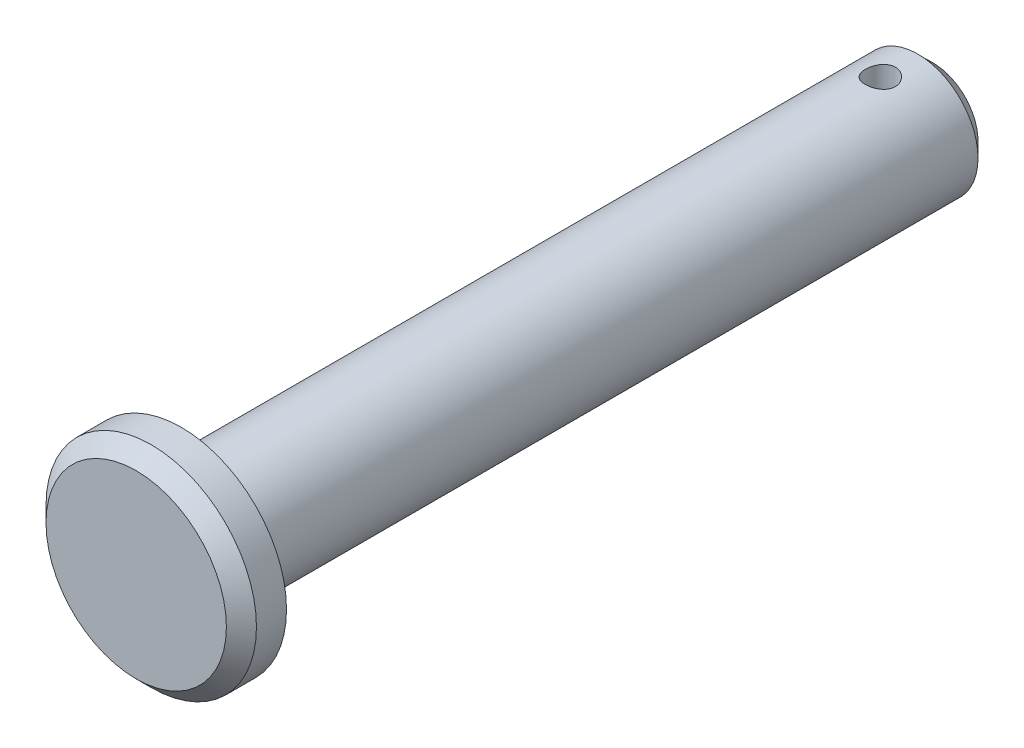
ISO-10303-21;
HEADER;
FILE_DESCRIPTION(('STEP AP214'),'2;1');
FILE_NAME('part.step','',(''),(''),'','','');
FILE_SCHEMA(('AUTOMOTIVE_DESIGN { 1 0 10303 214 1 1 1 1 }'));
ENDSEC;
DATA;
#1=APPLICATION_CONTEXT('core data for automotive mechanical design processes');
#2=APPLICATION_PROTOCOL_DEFINITION('international standard','automotive_design',2000,#1);
#3=PRODUCT_CONTEXT('',#1,'mechanical');
#4=PRODUCT('Part','Part','',(#3));
#5=PRODUCT_RELATED_PRODUCT_CATEGORY('part','',(#4));
#6=PRODUCT_DEFINITION_FORMATION('','',#4);
#7=PRODUCT_DEFINITION_CONTEXT('part definition',#1,'design');
#8=PRODUCT_DEFINITION('design','',#6,#7);
#9=PRODUCT_DEFINITION_SHAPE('','',#8);
#10=(LENGTH_UNIT() NAMED_UNIT(*) SI_UNIT(.MILLI.,.METRE.));
#11=(NAMED_UNIT(*) PLANE_ANGLE_UNIT() SI_UNIT($,.RADIAN.));
#12=(NAMED_UNIT(*) SI_UNIT($,.STERADIAN.) SOLID_ANGLE_UNIT());
#13=UNCERTAINTY_MEASURE_WITH_UNIT(LENGTH_MEASURE(1.E-05),#10,'distance_accuracy_value','');
#14=(GEOMETRIC_REPRESENTATION_CONTEXT(3) GLOBAL_UNCERTAINTY_ASSIGNED_CONTEXT((#13)) GLOBAL_UNIT_ASSIGNED_CONTEXT((#10,
#11,#12)) REPRESENTATION_CONTEXT('',''));
#15=CARTESIAN_POINT('',(0.,0.,0.));
#16=DIRECTION('',(0.,0.,1.));
#17=DIRECTION('',(1.,0.,0.));
#18=AXIS2_PLACEMENT_3D('',#15,#16,#17);
#19=CARTESIAN_POINT('',(0.,-20.1940334543548,3.5));
#20=DIRECTION('',(0.,1.,0.));
#21=DIRECTION('',(0.,0.,1.));
#22=AXIS2_PLACEMENT_3D('',#19,#20,#21);
#23=CYLINDRICAL_SURFACE('',#22,1.);
#24=CARTESIAN_POINT('',(0.,-4.,4.5));
#25=CARTESIAN_POINT('',(-0.0552507257798206,-3.99999906578675,4.49999844950789));
#26=CARTESIAN_POINT('',(-0.110518771887175,-3.99884385421219,4.49540563281747));
#27=CARTESIAN_POINT('',(-0.219470882513688,-3.99434742553262,4.477183232462));
#28=CARTESIAN_POINT('',(-0.27315403124716,-3.99100496946647,4.46354852697477));
#29=CARTESIAN_POINT('',(-0.377347248121717,-3.98250417554694,4.42770716435861));
#30=CARTESIAN_POINT('',(-0.427861042286667,-3.97734801894725,4.40551080085648));
#31=CARTESIAN_POINT('',(-0.524448087936283,-3.96576895871729,4.35321240663678));
#32=CARTESIAN_POINT('',(-0.570521189565839,-3.95934601236034,4.32311010925404));
#33=CARTESIAN_POINT('',(-0.657867951533947,-3.94578275727868,4.25519947356386));
#34=CARTESIAN_POINT('',(-0.699037126707381,-3.93863138099022,4.21725895002722));
#35=CARTESIAN_POINT('',(-0.774499284802202,-3.92449080078353,4.13503186339406));
#36=CARTESIAN_POINT('',(-0.808791491299423,-3.91750161525566,4.09074458470233));
#37=CARTESIAN_POINT('',(-0.870017695199355,-3.90436517133141,3.99626984884171));
#38=CARTESIAN_POINT('',(-0.896834810616904,-3.89823196313737,3.94600451279306));
#39=CARTESIAN_POINT('',(-0.941597939033685,-3.88766329874815,3.84150105889443));
#40=CARTESIAN_POINT('',(-0.959545370292889,-3.88322757115193,3.78726357778283));
#41=CARTESIAN_POINT('',(-0.985703224536194,-3.87666984478368,3.67750433453168));
#42=CARTESIAN_POINT('',(-0.994101512222225,-3.87450327383617,3.62203006930014));
#43=CARTESIAN_POINT('',(-1.00150785004523,-3.87259575025161,3.51042095399068));
#44=CARTESIAN_POINT('',(-1.00051742787865,-3.87285440299097,3.4542862128676));
#45=CARTESIAN_POINT('',(-0.989324349759521,-3.87572803664413,3.34438946150368));
#46=CARTESIAN_POINT('',(-0.979345560127013,-3.87828575334586,3.29060291902327));
#47=CARTESIAN_POINT('',(-0.950816124602071,-3.88537806450989,3.1854926327258));
#48=CARTESIAN_POINT('',(-0.932264868046283,-3.88991279980465,3.13416906464734));
#49=CARTESIAN_POINT('',(-0.886926318624769,-3.90050075936126,3.03484132249862));
#50=CARTESIAN_POINT('',(-0.860057778155272,-3.90656884979614,2.98687588547363));
#51=CARTESIAN_POINT('',(-0.798904184009968,-3.91953140564257,2.89605419349544));
#52=CARTESIAN_POINT('',(-0.764617832539226,-3.92642601556491,2.85319883462183));
#53=CARTESIAN_POINT('',(-0.688442283120812,-3.94050587026522,2.7725309228704));
#54=CARTESIAN_POINT('',(-0.646364172110573,-3.94769379651981,2.73489700662577));
#55=CARTESIAN_POINT('',(-0.556407945002465,-3.96137310385857,2.6671858383574));
#56=CARTESIAN_POINT('',(-0.508529651805295,-3.96786446366278,2.63710881715762));
#57=CARTESIAN_POINT('',(-0.408077259120927,-3.97945154729456,2.58529960918374));
#58=CARTESIAN_POINT('',(-0.355487595472414,-3.9845424008515,2.56359643983038));
#59=CARTESIAN_POINT('',(-0.247250672095254,-3.99271944660946,2.52938846286028));
#60=CARTESIAN_POINT('',(-0.191603999433656,-3.99580602226188,2.51688189572124));
#61=CARTESIAN_POINT('',(-0.080359980260018,-3.9995699951425,2.50169495629411));
#62=CARTESIAN_POINT('',(-0.0247978133254733,-4.00030702338852,2.4987713159498));
#63=CARTESIAN_POINT('',(0.0860219165343387,-3.99945869876301,2.50216600137033));
#64=CARTESIAN_POINT('',(0.14127950642973,-3.99787355494565,2.50848349519942));
#65=CARTESIAN_POINT('',(0.249076179184328,-3.99259720751572,2.52998060559425));
#66=CARTESIAN_POINT('',(0.301643412645835,-3.98893756123874,2.54502750898466));
#67=CARTESIAN_POINT('',(0.403504861635007,-3.97992471089423,2.58340472268563));
#68=CARTESIAN_POINT('',(0.452798746021757,-3.97457133579929,2.60673586954211));
#69=CARTESIAN_POINT('',(0.547682089619898,-3.96262205284208,2.66149075258315));
#70=CARTESIAN_POINT('',(0.593190294557219,-3.95600578244621,2.69305074159784));
#71=CARTESIAN_POINT('',(0.678351075762163,-3.94229672791613,2.76319327253131));
#72=CARTESIAN_POINT('',(0.718002639315339,-3.93520386167804,2.80177702641127));
#73=CARTESIAN_POINT('',(0.791327045381821,-3.92112637973848,2.88600130722964));
#74=CARTESIAN_POINT('',(0.824829245081355,-3.91414869458187,2.93179180200161));
#75=CARTESIAN_POINT('',(0.883673839341798,-3.90128585584826,3.02848842297714));
#76=CARTESIAN_POINT('',(0.909016596105291,-3.89540065378019,3.07939432197317));
#77=CARTESIAN_POINT('',(0.950634280406194,-3.88545396489778,3.18460381494206));
#78=CARTESIAN_POINT('',(0.96696293110271,-3.88138170194604,3.23888508556267));
#79=CARTESIAN_POINT('',(0.990230439969186,-3.87551162726789,3.34953975859274));
#80=CARTESIAN_POINT('',(0.997171351652439,-3.87371331813292,3.40591270068833));
#81=CARTESIAN_POINT('',(1.00135906022266,-3.87263267469306,3.51741401590347));
#82=CARTESIAN_POINT('',(0.998878598520078,-3.87327955152176,3.57253162341649));
#83=CARTESIAN_POINT('',(0.984918185541911,-3.87685272671895,3.68153592577866));
#84=CARTESIAN_POINT('',(0.973438415124512,-3.87977897927905,3.73542264534243));
#85=CARTESIAN_POINT('',(0.941954212961862,-3.88754173788483,3.84013897271027));
#86=CARTESIAN_POINT('',(0.922000936453582,-3.89236676824206,3.89098487016014));
#87=CARTESIAN_POINT('',(0.874176609070046,-3.90338503816552,3.9886435884758));
#88=CARTESIAN_POINT('',(0.846304460022792,-3.90957846747183,4.03545584879128));
#89=CARTESIAN_POINT('',(0.782578499091423,-3.92283756175676,4.12503641933468));
#90=CARTESIAN_POINT('',(0.746535441941501,-3.92992176554505,4.16766738228264));
#91=CARTESIAN_POINT('',(0.667859580793155,-3.94405351497524,4.24636469653027));
#92=CARTESIAN_POINT('',(0.625225214174096,-3.95110105151374,4.28242948674198));
#93=CARTESIAN_POINT('',(0.533645057801726,-3.96451770431776,4.34760753904307));
#94=CARTESIAN_POINT('',(0.484598948210923,-3.97087222243912,4.37658307578105));
#95=CARTESIAN_POINT('',(0.382177373006983,-3.98203283316746,4.42583164196035));
#96=CARTESIAN_POINT('',(0.328805042291159,-3.98684003466522,4.44611090709902));
#97=CARTESIAN_POINT('',(0.229606835495648,-3.99365373043695,4.47438122021977));
#98=CARTESIAN_POINT('',(0.184253447272046,-3.99601723368461,4.48396749536896));
#99=CARTESIAN_POINT('',(0.0926040476908554,-3.99919070154632,4.49677729574796));
#100=CARTESIAN_POINT('',(0.0463081074950775,-4.00000078300596,4.50000129953687));
#101=CARTESIAN_POINT('',(0.,-4.,4.5));
#102=B_SPLINE_CURVE_WITH_KNOTS('',3,(#24,#25,#26,#27,#28,#29,#30,#31,#32,#33,#34,#35,#36,#37,
#38,#39,#40,#41,#42,#43,#44,#45,#46,#47,#48,#49,#50,#51,#52,#53,#54,#55,#56,#57,#58,#59,#60,#61,
#62,#63,#64,#65,#66,#67,#68,#69,#70,#71,#72,#73,#74,#75,#76,#77,#78,#79,#80,#81,#82,#83,#84,#85,
#86,#87,#88,#89,#90,#91,#92,#93,#94,#95,#96,#97,#98,#99,#100,#101),.UNSPECIFIED.,.T.,.F.,(4,2,2,
2,2,2,2,2,2,2,2,2,2,2,2,2,2,2,2,2,2,2,2,2,2,2,2,2,2,2,2,2,2,2,2,2,2,2,4),(0.,0.165582474981259,
0.331258825175932,0.496736601524069,0.662219960112883,0.83076290291426,0.99932486386708,
1.17039098363871,1.34142974112912,1.50904196732953,1.67662692075131,1.84014998004679,
2.00368468977359,2.16887018582586,2.33408460557442,2.50401000646013,2.67394059705498,
2.84445486006076,3.01493649125762,3.18105539299517,3.34715934075162,3.51080183009358,
3.67446084881527,3.84102391710235,4.00761575338679,4.17829672802984,4.34897012499672,
4.51861503076025,4.68822282168272,4.85295853599075,5.0176909397069,5.18144267039632,
5.34521712091268,5.51326384273274,5.68135046513612,5.85248123666392,6.02348909214233,
6.16228161961433,6.3010637069536),.UNSPECIFIED.);
#103=CARTESIAN_POINT('',(0.,-4.,4.5));
#104=VERTEX_POINT('',#103);
#105=EDGE_CURVE('E19',#104,#104,#102,.F.);
#106=ORIENTED_EDGE('',*,*,#105,.F.);
#107=EDGE_LOOP('',(#106));
#108=FACE_BOUND('',#107,.T.);
#109=CARTESIAN_POINT('',(0.,4.,4.5));
#110=CARTESIAN_POINT('',(0.0552507257798206,3.99999906578675,4.49999844950789));
#111=CARTESIAN_POINT('',(0.110518771887175,3.99884385421219,4.49540563281747));
#112=CARTESIAN_POINT('',(0.219470882513688,3.99434742553262,4.477183232462));
#113=CARTESIAN_POINT('',(0.27315403124716,3.99100496946647,4.46354852697477));
#114=CARTESIAN_POINT('',(0.377347248121717,3.98250417554694,4.42770716435861));
#115=CARTESIAN_POINT('',(0.427861042286667,3.97734801894725,4.40551080085648));
#116=CARTESIAN_POINT('',(0.524448087936283,3.96576895871729,4.35321240663678));
#117=CARTESIAN_POINT('',(0.570521189565839,3.95934601236034,4.32311010925404));
#118=CARTESIAN_POINT('',(0.657867951533947,3.94578275727868,4.25519947356386));
#119=CARTESIAN_POINT('',(0.699037126707381,3.93863138099022,4.21725895002722));
#120=CARTESIAN_POINT('',(0.774499284802202,3.92449080078353,4.13503186339406));
#121=CARTESIAN_POINT('',(0.808791491299423,3.91750161525566,4.09074458470233));
#122=CARTESIAN_POINT('',(0.870017695199355,3.90436517133141,3.99626984884171));
#123=CARTESIAN_POINT('',(0.896834810616904,3.89823196313737,3.94600451279306));
#124=CARTESIAN_POINT('',(0.941597939033685,3.88766329874815,3.84150105889443));
#125=CARTESIAN_POINT('',(0.959545370292889,3.88322757115193,3.78726357778283));
#126=CARTESIAN_POINT('',(0.985703224536194,3.87666984478368,3.67750433453168));
#127=CARTESIAN_POINT('',(0.994101512222225,3.87450327383617,3.62203006930014));
#128=CARTESIAN_POINT('',(1.00150785004523,3.87259575025161,3.51042095399068));
#129=CARTESIAN_POINT('',(1.00051742787865,3.87285440299097,3.4542862128676));
#130=CARTESIAN_POINT('',(0.989324349759521,3.87572803664413,3.34438946150368));
#131=CARTESIAN_POINT('',(0.979345560127013,3.87828575334586,3.29060291902327));
#132=CARTESIAN_POINT('',(0.950816124602071,3.88537806450989,3.1854926327258));
#133=CARTESIAN_POINT('',(0.932264868046283,3.88991279980465,3.13416906464734));
#134=CARTESIAN_POINT('',(0.886926318624769,3.90050075936126,3.03484132249862));
#135=CARTESIAN_POINT('',(0.860057778155272,3.90656884979614,2.98687588547363));
#136=CARTESIAN_POINT('',(0.798904184009968,3.91953140564257,2.89605419349544));
#137=CARTESIAN_POINT('',(0.764617832539226,3.92642601556491,2.85319883462183));
#138=CARTESIAN_POINT('',(0.688442283120812,3.94050587026522,2.7725309228704));
#139=CARTESIAN_POINT('',(0.646364172110573,3.94769379651981,2.73489700662577));
#140=CARTESIAN_POINT('',(0.556407945002465,3.96137310385857,2.6671858383574));
#141=CARTESIAN_POINT('',(0.508529651805295,3.96786446366278,2.63710881715762));
#142=CARTESIAN_POINT('',(0.408077259120927,3.97945154729456,2.58529960918374));
#143=CARTESIAN_POINT('',(0.355487595472414,3.9845424008515,2.56359643983038));
#144=CARTESIAN_POINT('',(0.247250672095254,3.99271944660946,2.52938846286028));
#145=CARTESIAN_POINT('',(0.191603999433656,3.99580602226188,2.51688189572124));
#146=CARTESIAN_POINT('',(0.080359980260018,3.9995699951425,2.50169495629411));
#147=CARTESIAN_POINT('',(0.0247978133254733,4.00030702338852,2.4987713159498));
#148=CARTESIAN_POINT('',(-0.0860219165343387,3.99945869876301,2.50216600137033));
#149=CARTESIAN_POINT('',(-0.14127950642973,3.99787355494565,2.50848349519942));
#150=CARTESIAN_POINT('',(-0.249076179184328,3.99259720751572,2.52998060559425));
#151=CARTESIAN_POINT('',(-0.301643412645835,3.98893756123874,2.54502750898466));
#152=CARTESIAN_POINT('',(-0.403504861635007,3.97992471089423,2.58340472268563));
#153=CARTESIAN_POINT('',(-0.452798746021757,3.97457133579929,2.60673586954211));
#154=CARTESIAN_POINT('',(-0.547682089619898,3.96262205284208,2.66149075258315));
#155=CARTESIAN_POINT('',(-0.593190294557219,3.95600578244621,2.69305074159784));
#156=CARTESIAN_POINT('',(-0.678351075762163,3.94229672791613,2.76319327253131));
#157=CARTESIAN_POINT('',(-0.718002639315339,3.93520386167804,2.80177702641127));
#158=CARTESIAN_POINT('',(-0.791327045381821,3.92112637973848,2.88600130722964));
#159=CARTESIAN_POINT('',(-0.824829245081355,3.91414869458187,2.93179180200161));
#160=CARTESIAN_POINT('',(-0.883673839341798,3.90128585584826,3.02848842297714));
#161=CARTESIAN_POINT('',(-0.909016596105291,3.89540065378019,3.07939432197317));
#162=CARTESIAN_POINT('',(-0.950634280406194,3.88545396489778,3.18460381494206));
#163=CARTESIAN_POINT('',(-0.96696293110271,3.88138170194604,3.23888508556267));
#164=CARTESIAN_POINT('',(-0.990230439969186,3.87551162726789,3.34953975859274));
#165=CARTESIAN_POINT('',(-0.997171351652439,3.87371331813292,3.40591270068833));
#166=CARTESIAN_POINT('',(-1.00135906022266,3.87263267469306,3.51741401590347));
#167=CARTESIAN_POINT('',(-0.998878598520078,3.87327955152176,3.57253162341649));
#168=CARTESIAN_POINT('',(-0.984918185541911,3.87685272671895,3.68153592577866));
#169=CARTESIAN_POINT('',(-0.973438415124512,3.87977897927905,3.73542264534243));
#170=CARTESIAN_POINT('',(-0.941954212961862,3.88754173788483,3.84013897271027));
#171=CARTESIAN_POINT('',(-0.922000936453582,3.89236676824206,3.89098487016014));
#172=CARTESIAN_POINT('',(-0.874176609070046,3.90338503816552,3.9886435884758));
#173=CARTESIAN_POINT('',(-0.846304460022792,3.90957846747183,4.03545584879128));
#174=CARTESIAN_POINT('',(-0.782578499091423,3.92283756175676,4.12503641933468));
#175=CARTESIAN_POINT('',(-0.746535441941501,3.92992176554505,4.16766738228264));
#176=CARTESIAN_POINT('',(-0.667859580793155,3.94405351497524,4.24636469653027));
#177=CARTESIAN_POINT('',(-0.625225214174096,3.95110105151374,4.28242948674198));
#178=CARTESIAN_POINT('',(-0.533645057801726,3.96451770431776,4.34760753904307));
#179=CARTESIAN_POINT('',(-0.484598948210923,3.97087222243912,4.37658307578105));
#180=CARTESIAN_POINT('',(-0.382177373006983,3.98203283316746,4.42583164196035));
#181=CARTESIAN_POINT('',(-0.328805042291159,3.98684003466522,4.44611090709902));
#182=CARTESIAN_POINT('',(-0.229606835495648,3.99365373043695,4.47438122021977));
#183=CARTESIAN_POINT('',(-0.184253447272046,3.99601723368461,4.48396749536896));
#184=CARTESIAN_POINT('',(-0.0926040476908554,3.99919070154632,4.49677729574796));
#185=CARTESIAN_POINT('',(-0.0463081074950775,4.00000078300596,4.50000129953687));
#186=CARTESIAN_POINT('',(0.,4.,4.5));
#187=B_SPLINE_CURVE_WITH_KNOTS('',3,(#109,#110,#111,#112,#113,#114,#115,#116,#117,#118,#119,
#120,#121,#122,#123,#124,#125,#126,#127,#128,#129,#130,#131,#132,#133,#134,#135,#136,#137,#138,
#139,#140,#141,#142,#143,#144,#145,#146,#147,#148,#149,#150,#151,#152,#153,#154,#155,#156,#157,
#158,#159,#160,#161,#162,#163,#164,#165,#166,#167,#168,#169,#170,#171,#172,#173,#174,#175,#176,
#177,#178,#179,#180,#181,#182,#183,#184,#185,#186),.UNSPECIFIED.,.T.,.F.,(4,2,2,2,2,2,2,2,2,2,2,
2,2,2,2,2,2,2,2,2,2,2,2,2,2,2,2,2,2,2,2,2,2,2,2,2,2,2,4),(0.,0.165582474981259,
0.331258825175932,0.496736601524069,0.662219960112883,0.83076290291426,0.99932486386708,
1.17039098363871,1.34142974112912,1.50904196732953,1.67662692075131,1.84014998004679,
2.00368468977359,2.16887018582586,2.33408460557442,2.50401000646013,2.67394059705498,
2.84445486006076,3.01493649125762,3.18105539299517,3.34715934075162,3.51080183009358,
3.67446084881527,3.84102391710235,4.00761575338679,4.17829672802984,4.34897012499672,
4.51861503076025,4.68822282168272,4.85295853599075,5.0176909397069,5.18144267039632,
5.34521712091268,5.51326384273274,5.68135046513612,5.85248123666392,6.02348909214233,
6.16228161961433,6.3010637069536),.UNSPECIFIED.);
#188=CARTESIAN_POINT('',(0.,4.,4.5));
#189=VERTEX_POINT('',#188);
#190=EDGE_CURVE('E41',#189,#189,#187,.F.);
#191=ORIENTED_EDGE('',*,*,#190,.F.);
#192=EDGE_LOOP('',(#191));
#193=FACE_BOUND('',#192,.T.);
#194=ADVANCED_FACE('F15',(#108,#193),#23,.F.);
#195=CARTESIAN_POINT('',(0.,0.,53.));
#196=DIRECTION('',(0.,0.,-1.));
#197=DIRECTION('',(-1.,0.,0.));
#198=AXIS2_PLACEMENT_3D('',#195,#196,#197);
#199=CONICAL_SURFACE('',#198,6.,0.785398163397448);
#200=CARTESIAN_POINT('',(0.,0.,53.));
#201=DIRECTION('',(0.,0.,1.));
#202=DIRECTION('',(-1.,0.,0.));
#203=AXIS2_PLACEMENT_3D('',#200,#201,#202);
#204=CIRCLE('',#203,6.);
#205=CARTESIAN_POINT('',(-6.,0.,53.));
#206=VERTEX_POINT('',#205);
#207=EDGE_CURVE('E10',#206,#206,#204,.T.);
#208=ORIENTED_EDGE('',*,*,#207,.F.);
#209=EDGE_LOOP('',(#208));
#210=FACE_BOUND('',#209,.T.);
#211=CARTESIAN_POINT('',(0.,0.,52.));
#212=DIRECTION('',(0.,0.,-1.));
#213=DIRECTION('',(-1.,0.,0.));
#214=AXIS2_PLACEMENT_3D('',#211,#212,#213);
#215=CIRCLE('',#214,7.);
#216=CARTESIAN_POINT('',(-7.,0.,52.));
#217=VERTEX_POINT('',#216);
#218=EDGE_CURVE('E28',#217,#217,#215,.T.);
#219=ORIENTED_EDGE('',*,*,#218,.F.);
#220=EDGE_LOOP('',(#219));
#221=FACE_BOUND('',#220,.T.);
#222=ADVANCED_FACE('F69',(#210,#221),#199,.T.);
#223=CARTESIAN_POINT('',(0.,0.,1.));
#224=DIRECTION('',(0.,0.,1.));
#225=DIRECTION('',(1.,0.,0.));
#226=AXIS2_PLACEMENT_3D('',#223,#224,#225);
#227=CONICAL_SURFACE('',#226,4.,0.785398163397448);
#228=CARTESIAN_POINT('',(0.,0.,1.));
#229=DIRECTION('',(0.,0.,1.));
#230=DIRECTION('',(1.,0.,0.));
#231=AXIS2_PLACEMENT_3D('',#228,#229,#230);
#232=CIRCLE('',#231,4.);
#233=CARTESIAN_POINT('',(4.,0.,1.));
#234=VERTEX_POINT('',#233);
#235=EDGE_CURVE('E47',#234,#234,#232,.T.);
#236=ORIENTED_EDGE('',*,*,#235,.F.);
#237=EDGE_LOOP('',(#236));
#238=FACE_BOUND('',#237,.T.);
#239=CARTESIAN_POINT('',(0.,0.,0.));
#240=DIRECTION('',(0.,0.,-1.));
#241=DIRECTION('',(1.,0.,0.));
#242=AXIS2_PLACEMENT_3D('',#239,#240,#241);
#243=CIRCLE('',#242,3.);
#244=CARTESIAN_POINT('',(3.,0.,0.));
#245=VERTEX_POINT('',#244);
#246=EDGE_CURVE('E90',#245,#245,#243,.T.);
#247=ORIENTED_EDGE('',*,*,#246,.F.);
#248=EDGE_LOOP('',(#247));
#249=FACE_BOUND('',#248,.T.);
#250=ADVANCED_FACE('F67',(#238,#249),#227,.T.);
#251=CARTESIAN_POINT('',(7.,0.,53.));
#252=DIRECTION('',(0.,0.,-1.));
#253=DIRECTION('',(0.,-1.,0.));
#254=AXIS2_PLACEMENT_3D('',#251,#252,#253);
#255=PLANE('',#254);
#256=ORIENTED_EDGE('',*,*,#207,.T.);
#257=EDGE_LOOP('',(#256));
#258=FACE_BOUND('',#257,.T.);
#259=ADVANCED_FACE('F63',(#258),#255,.F.);
#260=CARTESIAN_POINT('',(0.,0.,53.));
#261=DIRECTION('',(0.,0.,1.));
#262=DIRECTION('',(1.,0.,0.));
#263=AXIS2_PLACEMENT_3D('',#260,#261,#262);
#264=CYLINDRICAL_SURFACE('',#263,7.);
#265=CARTESIAN_POINT('',(0.,0.,50.));
#266=DIRECTION('',(0.,0.,1.));
#267=DIRECTION('',(1.,0.,0.));
#268=AXIS2_PLACEMENT_3D('',#265,#266,#267);
#269=CIRCLE('',#268,7.);
#270=CARTESIAN_POINT('',(7.,0.,50.));
#271=VERTEX_POINT('',#270);
#272=EDGE_CURVE('E38',#271,#271,#269,.T.);
#273=ORIENTED_EDGE('',*,*,#272,.T.);
#274=EDGE_LOOP('',(#273));
#275=FACE_BOUND('',#274,.T.);
#276=ORIENTED_EDGE('',*,*,#218,.T.);
#277=EDGE_LOOP('',(#276));
#278=FACE_BOUND('',#277,.T.);
#279=ADVANCED_FACE('F59',(#275,#278),#264,.T.);
#280=CARTESIAN_POINT('',(4.,0.,50.));
#281=DIRECTION('',(0.,0.,1.));
#282=DIRECTION('',(1.,0.,0.));
#283=AXIS2_PLACEMENT_3D('',#280,#281,#282);
#284=PLANE('',#283);
#285=CARTESIAN_POINT('',(0.,0.,50.));
#286=DIRECTION('',(0.,0.,1.));
#287=DIRECTION('',(1.,0.,0.));
#288=AXIS2_PLACEMENT_3D('',#285,#286,#287);
#289=CIRCLE('',#288,4.);
#290=CARTESIAN_POINT('',(4.,0.,50.));
#291=VERTEX_POINT('',#290);
#292=EDGE_CURVE('E101',#291,#291,#289,.T.);
#293=ORIENTED_EDGE('',*,*,#292,.T.);
#294=EDGE_LOOP('',(#293));
#295=FACE_BOUND('',#294,.T.);
#296=ORIENTED_EDGE('',*,*,#272,.F.);
#297=EDGE_LOOP('',(#296));
#298=FACE_BOUND('',#297,.T.);
#299=ADVANCED_FACE('F54',(#295,#298),#284,.F.);
#300=CARTESIAN_POINT('',(0.,0.,53.));
#301=DIRECTION('',(0.,0.,1.));
#302=DIRECTION('',(1.,0.,0.));
#303=AXIS2_PLACEMENT_3D('',#300,#301,#302);
#304=CYLINDRICAL_SURFACE('',#303,4.);
#305=ORIENTED_EDGE('',*,*,#292,.F.);
#306=EDGE_LOOP('',(#305));
#307=FACE_BOUND('',#306,.T.);
#308=ORIENTED_EDGE('',*,*,#235,.T.);
#309=EDGE_LOOP('',(#308));
#310=FACE_BOUND('',#309,.T.);
#311=ORIENTED_EDGE('',*,*,#190,.T.);
#312=EDGE_LOOP('',(#311));
#313=FACE_BOUND('',#312,.T.);
#314=ORIENTED_EDGE('',*,*,#105,.T.);
#315=EDGE_LOOP('',(#314));
#316=FACE_BOUND('',#315,.T.);
#317=ADVANCED_FACE('F48',(#307,#310,#313,#316),#304,.T.);
#318=CARTESIAN_POINT('',(0.,0.,0.));
#319=DIRECTION('',(0.,0.,1.));
#320=DIRECTION('',(1.,0.,0.));
#321=AXIS2_PLACEMENT_3D('',#318,#319,#320);
#322=PLANE('',#321);
#323=ORIENTED_EDGE('',*,*,#246,.T.);
#324=EDGE_LOOP('',(#323));
#325=FACE_BOUND('',#324,.T.);
#326=ADVANCED_FACE('F53',(#325),#322,.F.);
#327=CLOSED_SHELL('',(#194,#222,#250,#259,#279,#299,#317,#326));
#328=MANIFOLD_SOLID_BREP('B1',#327);
#329=ADVANCED_BREP_SHAPE_REPRESENTATION('',(#18,#328),#14);
#330=SHAPE_DEFINITION_REPRESENTATION(#9,#329);
ENDSEC;
END-ISO-10303-21;
